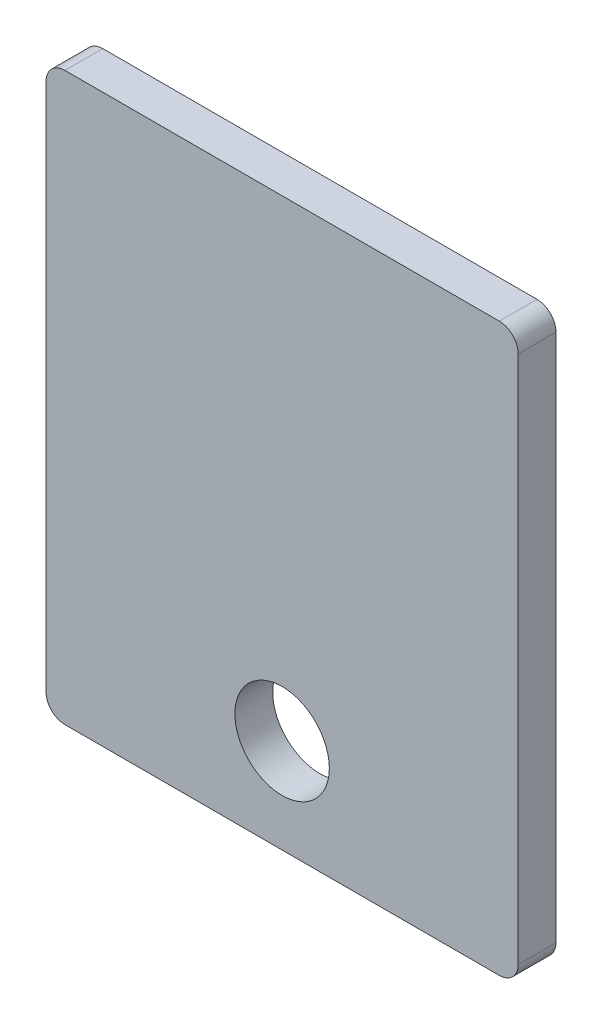
ISO-10303-21;
HEADER;
FILE_DESCRIPTION(('STEP AP214'),'2;1');
FILE_NAME('part.step','',(''),(''),'','','');
FILE_SCHEMA(('AUTOMOTIVE_DESIGN { 1 0 10303 214 1 1 1 1 }'));
ENDSEC;
DATA;
#1=APPLICATION_CONTEXT('core data for automotive mechanical design processes');
#2=APPLICATION_PROTOCOL_DEFINITION('international standard','automotive_design',2000,#1);
#3=PRODUCT_CONTEXT('',#1,'mechanical');
#4=PRODUCT('Part','Part','',(#3));
#5=PRODUCT_RELATED_PRODUCT_CATEGORY('part','',(#4));
#6=PRODUCT_DEFINITION_FORMATION('','',#4);
#7=PRODUCT_DEFINITION_CONTEXT('part definition',#1,'design');
#8=PRODUCT_DEFINITION('design','',#6,#7);
#9=PRODUCT_DEFINITION_SHAPE('','',#8);
#10=(LENGTH_UNIT() NAMED_UNIT(*) SI_UNIT(.MILLI.,.METRE.));
#11=(NAMED_UNIT(*) PLANE_ANGLE_UNIT() SI_UNIT($,.RADIAN.));
#12=(NAMED_UNIT(*) SI_UNIT($,.STERADIAN.) SOLID_ANGLE_UNIT());
#13=UNCERTAINTY_MEASURE_WITH_UNIT(LENGTH_MEASURE(1.E-05),#10,'distance_accuracy_value','');
#14=(GEOMETRIC_REPRESENTATION_CONTEXT(3) GLOBAL_UNCERTAINTY_ASSIGNED_CONTEXT((#13)) GLOBAL_UNIT_ASSIGNED_CONTEXT((#10,
#11,#12)) REPRESENTATION_CONTEXT('',''));
#15=CARTESIAN_POINT('',(0.,0.,0.));
#16=DIRECTION('',(0.,0.,1.));
#17=DIRECTION('',(1.,0.,0.));
#18=AXIS2_PLACEMENT_3D('',#15,#16,#17);
#19=CARTESIAN_POINT('',(0.,-10.,0.));
#20=DIRECTION('',(0.,0.,-1.));
#21=DIRECTION('',(1.,0.,0.));
#22=AXIS2_PLACEMENT_3D('',#19,#20,#21);
#23=CYLINDRICAL_SURFACE('',#22,2.5);
#24=DIRECTION('',(0.,0.,1.));
#25=VECTOR('',#24,1.);
#26=CARTESIAN_POINT('',(2.5,-10.,0.));
#27=LINE('',#26,#25);
#28=CARTESIAN_POINT('',(2.5,-10.,0.));
#29=VERTEX_POINT('',#28);
#30=CARTESIAN_POINT('',(2.5,-10.,2.));
#31=VERTEX_POINT('',#30);
#32=EDGE_CURVE('E9',#29,#31,#27,.T.);
#33=ORIENTED_EDGE('',*,*,#32,.T.);
#34=CARTESIAN_POINT('',(0.,-10.,2.));
#35=DIRECTION('',(0.,0.,1.));
#36=DIRECTION('',(1.,0.,0.));
#37=AXIS2_PLACEMENT_3D('',#34,#35,#36);
#38=CIRCLE('',#37,2.5);
#39=EDGE_CURVE('E203',#31,#31,#38,.T.);
#40=ORIENTED_EDGE('',*,*,#39,.T.);
#41=ORIENTED_EDGE('',*,*,#32,.F.);
#42=CARTESIAN_POINT('',(0.,-10.,0.));
#43=DIRECTION('',(0.,0.,1.));
#44=DIRECTION('',(1.,0.,0.));
#45=AXIS2_PLACEMENT_3D('',#42,#43,#44);
#46=CIRCLE('',#45,2.5);
#47=EDGE_CURVE('E160',#29,#29,#46,.T.);
#48=ORIENTED_EDGE('',*,*,#47,.F.);
#49=EDGE_LOOP('',(#33,#40,#41,#48));
#50=FACE_BOUND('',#49,.T.);
#51=ADVANCED_FACE('F14',(#50),#23,.F.);
#52=CARTESIAN_POINT('',(12.5,-15.,0.));
#53=DIRECTION('',(-1.,0.,0.));
#54=DIRECTION('',(0.,0.,1.));
#55=AXIS2_PLACEMENT_3D('',#52,#53,#54);
#56=PLANE('',#55);
#57=DIRECTION('',(0.,0.,1.));
#58=VECTOR('',#57,1.);
#59=CARTESIAN_POINT('',(12.5,14.,0.));
#60=LINE('',#59,#58);
#61=CARTESIAN_POINT('',(12.5,14.,0.));
#62=VERTEX_POINT('',#61);
#63=CARTESIAN_POINT('',(12.5,14.,2.));
#64=VERTEX_POINT('',#63);
#65=EDGE_CURVE('E63',#62,#64,#60,.T.);
#66=ORIENTED_EDGE('',*,*,#65,.T.);
#67=DIRECTION('',(0.,1.,0.));
#68=VECTOR('',#67,1.);
#69=CARTESIAN_POINT('',(12.5,-15.,2.));
#70=LINE('',#69,#68);
#71=CARTESIAN_POINT('',(12.5,-14.,2.));
#72=VERTEX_POINT('',#71);
#73=EDGE_CURVE('E171',#72,#64,#70,.T.);
#74=ORIENTED_EDGE('',*,*,#73,.F.);
#75=DIRECTION('',(0.,0.,1.));
#76=VECTOR('',#75,1.);
#77=CARTESIAN_POINT('',(12.5,-14.,0.));
#78=LINE('',#77,#76);
#79=CARTESIAN_POINT('',(12.5,-14.,0.));
#80=VERTEX_POINT('',#79);
#81=EDGE_CURVE('E25',#80,#72,#78,.T.);
#82=ORIENTED_EDGE('',*,*,#81,.F.);
#83=DIRECTION('',(0.,1.,0.));
#84=VECTOR('',#83,1.);
#85=CARTESIAN_POINT('',(12.5,-15.,0.));
#86=LINE('',#85,#84);
#87=EDGE_CURVE('E154',#80,#62,#86,.T.);
#88=ORIENTED_EDGE('',*,*,#87,.T.);
#89=EDGE_LOOP('',(#66,#74,#82,#88));
#90=FACE_BOUND('',#89,.T.);
#91=ADVANCED_FACE('F312',(#90),#56,.F.);
#92=CARTESIAN_POINT('',(11.5,-14.,0.));
#93=DIRECTION('',(0.,0.,1.));
#94=DIRECTION('',(0.,-1.,0.));
#95=AXIS2_PLACEMENT_3D('',#92,#93,#94);
#96=CYLINDRICAL_SURFACE('',#95,1.);
#97=CARTESIAN_POINT('',(11.5,-14.,0.));
#98=DIRECTION('',(0.,0.,1.));
#99=DIRECTION('',(0.,-1.,0.));
#100=AXIS2_PLACEMENT_3D('',#97,#98,#99);
#101=CIRCLE('',#100,1.);
#102=CARTESIAN_POINT('',(11.5,-15.,0.));
#103=VERTEX_POINT('',#102);
#104=EDGE_CURVE('E150',#103,#80,#101,.T.);
#105=ORIENTED_EDGE('',*,*,#104,.T.);
#106=ORIENTED_EDGE('',*,*,#81,.T.);
#107=CARTESIAN_POINT('',(11.5,-14.,2.));
#108=DIRECTION('',(0.,0.,1.));
#109=DIRECTION('',(0.,-1.,0.));
#110=AXIS2_PLACEMENT_3D('',#107,#108,#109);
#111=CIRCLE('',#110,1.);
#112=CARTESIAN_POINT('',(11.5,-15.,2.));
#113=VERTEX_POINT('',#112);
#114=EDGE_CURVE('E167',#113,#72,#111,.T.);
#115=ORIENTED_EDGE('',*,*,#114,.F.);
#116=DIRECTION('',(0.,0.,1.));
#117=VECTOR('',#116,1.);
#118=CARTESIAN_POINT('',(11.5,-15.,0.));
#119=LINE('',#118,#117);
#120=EDGE_CURVE('E177',#103,#113,#119,.T.);
#121=ORIENTED_EDGE('',*,*,#120,.F.);
#122=EDGE_LOOP('',(#105,#106,#115,#121));
#123=FACE_BOUND('',#122,.T.);
#124=ADVANCED_FACE('F16',(#123),#96,.T.);
#125=CARTESIAN_POINT('',(11.5,14.,0.));
#126=DIRECTION('',(0.,0.,1.));
#127=DIRECTION('',(1.,0.,0.));
#128=AXIS2_PLACEMENT_3D('',#125,#126,#127);
#129=CYLINDRICAL_SURFACE('',#128,1.);
#130=CARTESIAN_POINT('',(11.5,14.,0.));
#131=DIRECTION('',(0.,0.,1.));
#132=DIRECTION('',(0.,-1.,0.));
#133=AXIS2_PLACEMENT_3D('',#130,#131,#132);
#134=CIRCLE('',#133,1.);
#135=CARTESIAN_POINT('',(11.5,15.,0.));
#136=VERTEX_POINT('',#135);
#137=EDGE_CURVE('E151',#62,#136,#134,.T.);
#138=ORIENTED_EDGE('',*,*,#137,.T.);
#139=DIRECTION('',(0.,0.,1.));
#140=VECTOR('',#139,1.);
#141=CARTESIAN_POINT('',(11.5,15.,0.));
#142=LINE('',#141,#140);
#143=CARTESIAN_POINT('',(11.5,15.,2.));
#144=VERTEX_POINT('',#143);
#145=EDGE_CURVE('E180',#136,#144,#142,.T.);
#146=ORIENTED_EDGE('',*,*,#145,.T.);
#147=CARTESIAN_POINT('',(11.5,14.,2.));
#148=DIRECTION('',(0.,0.,1.));
#149=DIRECTION('',(0.,-1.,0.));
#150=AXIS2_PLACEMENT_3D('',#147,#148,#149);
#151=CIRCLE('',#150,1.);
#152=EDGE_CURVE('E172',#64,#144,#151,.T.);
#153=ORIENTED_EDGE('',*,*,#152,.F.);
#154=ORIENTED_EDGE('',*,*,#65,.F.);
#155=EDGE_LOOP('',(#138,#146,#153,#154));
#156=FACE_BOUND('',#155,.T.);
#157=ADVANCED_FACE('F311',(#156),#129,.T.);
#158=CARTESIAN_POINT('',(-12.5,-15.,0.));
#159=DIRECTION('',(0.,1.,0.));
#160=DIRECTION('',(1.,0.,0.));
#161=AXIS2_PLACEMENT_3D('',#158,#159,#160);
#162=PLANE('',#161);
#163=ORIENTED_EDGE('',*,*,#120,.T.);
#164=DIRECTION('',(1.,0.,0.));
#165=VECTOR('',#164,1.);
#166=CARTESIAN_POINT('',(-12.5,-15.,2.));
#167=LINE('',#166,#165);
#168=CARTESIAN_POINT('',(-11.5,-15.,2.));
#169=VERTEX_POINT('',#168);
#170=EDGE_CURVE('E18',#169,#113,#167,.T.);
#171=ORIENTED_EDGE('',*,*,#170,.F.);
#172=DIRECTION('',(0.,0.,1.));
#173=VECTOR('',#172,1.);
#174=CARTESIAN_POINT('',(-11.5,-15.,0.));
#175=LINE('',#174,#173);
#176=CARTESIAN_POINT('',(-11.5,-15.,0.));
#177=VERTEX_POINT('',#176);
#178=EDGE_CURVE('E121',#177,#169,#175,.T.);
#179=ORIENTED_EDGE('',*,*,#178,.F.);
#180=DIRECTION('',(1.,0.,0.));
#181=VECTOR('',#180,1.);
#182=CARTESIAN_POINT('',(-12.5,-15.,0.));
#183=LINE('',#182,#181);
#184=EDGE_CURVE('E145',#177,#103,#183,.T.);
#185=ORIENTED_EDGE('',*,*,#184,.T.);
#186=EDGE_LOOP('',(#163,#171,#179,#185));
#187=FACE_BOUND('',#186,.T.);
#188=ADVANCED_FACE('F233',(#187),#162,.F.);
#189=CARTESIAN_POINT('',(12.5,15.,0.));
#190=DIRECTION('',(0.,-1.,0.));
#191=DIRECTION('',(0.,0.,-1.));
#192=AXIS2_PLACEMENT_3D('',#189,#190,#191);
#193=PLANE('',#192);
#194=DIRECTION('',(0.,0.,1.));
#195=VECTOR('',#194,1.);
#196=CARTESIAN_POINT('',(-11.5,15.,0.));
#197=LINE('',#196,#195);
#198=CARTESIAN_POINT('',(-11.5,15.,0.));
#199=VERTEX_POINT('',#198);
#200=CARTESIAN_POINT('',(-11.5,15.,2.));
#201=VERTEX_POINT('',#200);
#202=EDGE_CURVE('E163',#199,#201,#197,.T.);
#203=ORIENTED_EDGE('',*,*,#202,.T.);
#204=DIRECTION('',(-1.,0.,0.));
#205=VECTOR('',#204,1.);
#206=CARTESIAN_POINT('',(12.5,15.,2.));
#207=LINE('',#206,#205);
#208=EDGE_CURVE('E176',#144,#201,#207,.T.);
#209=ORIENTED_EDGE('',*,*,#208,.F.);
#210=ORIENTED_EDGE('',*,*,#145,.F.);
#211=DIRECTION('',(-1.,0.,0.));
#212=VECTOR('',#211,1.);
#213=CARTESIAN_POINT('',(12.5,15.,0.));
#214=LINE('',#213,#212);
#215=EDGE_CURVE('E155',#136,#199,#214,.T.);
#216=ORIENTED_EDGE('',*,*,#215,.T.);
#217=EDGE_LOOP('',(#203,#209,#210,#216));
#218=FACE_BOUND('',#217,.T.);
#219=ADVANCED_FACE('F218',(#218),#193,.F.);
#220=CARTESIAN_POINT('',(0.,-1.056211139859,2.));
#221=DIRECTION('',(0.,0.,1.));
#222=DIRECTION('',(1.,0.,0.));
#223=AXIS2_PLACEMENT_3D('',#220,#221,#222);
#224=PLANE('',#223);
#225=ORIENTED_EDGE('',*,*,#39,.F.);
#226=EDGE_LOOP('',(#225));
#227=FACE_BOUND('',#226,.T.);
#228=DIRECTION('',(0.,-1.,0.));
#229=VECTOR('',#228,1.);
#230=CARTESIAN_POINT('',(-12.5,15.,2.));
#231=LINE('',#230,#229);
#232=CARTESIAN_POINT('',(-12.5,14.,2.));
#233=VERTEX_POINT('',#232);
#234=CARTESIAN_POINT('',(-12.5,-14.,2.));
#235=VERTEX_POINT('',#234);
#236=EDGE_CURVE('E126',#233,#235,#231,.T.);
#237=ORIENTED_EDGE('',*,*,#236,.T.);
#238=CARTESIAN_POINT('',(-11.5,-14.,2.));
#239=DIRECTION('',(0.,0.,1.));
#240=DIRECTION('',(0.,-1.,0.));
#241=AXIS2_PLACEMENT_3D('',#238,#239,#240);
#242=CIRCLE('',#241,1.);
#243=EDGE_CURVE('E115',#235,#169,#242,.T.);
#244=ORIENTED_EDGE('',*,*,#243,.T.);
#245=ORIENTED_EDGE('',*,*,#170,.T.);
#246=ORIENTED_EDGE('',*,*,#114,.T.);
#247=ORIENTED_EDGE('',*,*,#73,.T.);
#248=ORIENTED_EDGE('',*,*,#152,.T.);
#249=ORIENTED_EDGE('',*,*,#208,.T.);
#250=CARTESIAN_POINT('',(-11.5,14.,2.));
#251=DIRECTION('',(0.,0.,-1.));
#252=DIRECTION('',(0.,-1.,0.));
#253=AXIS2_PLACEMENT_3D('',#250,#251,#252);
#254=CIRCLE('',#253,1.);
#255=EDGE_CURVE('E104',#233,#201,#254,.T.);
#256=ORIENTED_EDGE('',*,*,#255,.F.);
#257=EDGE_LOOP('',(#237,#244,#245,#246,#247,#248,#249,#256));
#258=FACE_BOUND('',#257,.T.);
#259=ADVANCED_FACE('F127',(#227,#258),#224,.T.);
#260=CARTESIAN_POINT('',(-11.5,-14.,0.));
#261=DIRECTION('',(0.,0.,1.));
#262=DIRECTION('',(-1.,0.,0.));
#263=AXIS2_PLACEMENT_3D('',#260,#261,#262);
#264=CYLINDRICAL_SURFACE('',#263,1.);
#265=CARTESIAN_POINT('',(-11.5,-14.,0.));
#266=DIRECTION('',(0.,0.,1.));
#267=DIRECTION('',(0.,-1.,0.));
#268=AXIS2_PLACEMENT_3D('',#265,#266,#267);
#269=CIRCLE('',#268,1.);
#270=CARTESIAN_POINT('',(-12.5,-14.,0.));
#271=VERTEX_POINT('',#270);
#272=EDGE_CURVE('E149',#271,#177,#269,.T.);
#273=ORIENTED_EDGE('',*,*,#272,.T.);
#274=ORIENTED_EDGE('',*,*,#178,.T.);
#275=ORIENTED_EDGE('',*,*,#243,.F.);
#276=DIRECTION('',(0.,0.,1.));
#277=VECTOR('',#276,1.);
#278=CARTESIAN_POINT('',(-12.5,-14.,0.));
#279=LINE('',#278,#277);
#280=EDGE_CURVE('E119',#271,#235,#279,.T.);
#281=ORIENTED_EDGE('',*,*,#280,.F.);
#282=EDGE_LOOP('',(#273,#274,#275,#281));
#283=FACE_BOUND('',#282,.T.);
#284=ADVANCED_FACE('F117',(#283),#264,.T.);
#285=CARTESIAN_POINT('',(-11.5,14.,0.));
#286=DIRECTION('',(0.,0.,1.));
#287=DIRECTION('',(-1.,0.,0.));
#288=AXIS2_PLACEMENT_3D('',#285,#286,#287);
#289=CYLINDRICAL_SURFACE('',#288,1.);
#290=DIRECTION('',(0.,0.,1.));
#291=VECTOR('',#290,1.);
#292=CARTESIAN_POINT('',(-12.5,14.,0.));
#293=LINE('',#292,#291);
#294=CARTESIAN_POINT('',(-12.5,14.,0.));
#295=VERTEX_POINT('',#294);
#296=EDGE_CURVE('E131',#295,#233,#293,.T.);
#297=ORIENTED_EDGE('',*,*,#296,.T.);
#298=ORIENTED_EDGE('',*,*,#255,.T.);
#299=ORIENTED_EDGE('',*,*,#202,.F.);
#300=CARTESIAN_POINT('',(-11.5,14.,0.));
#301=DIRECTION('',(0.,0.,-1.));
#302=DIRECTION('',(0.,-1.,0.));
#303=AXIS2_PLACEMENT_3D('',#300,#301,#302);
#304=CIRCLE('',#303,1.);
#305=EDGE_CURVE('E186',#295,#199,#304,.T.);
#306=ORIENTED_EDGE('',*,*,#305,.F.);
#307=EDGE_LOOP('',(#297,#298,#299,#306));
#308=FACE_BOUND('',#307,.T.);
#309=ADVANCED_FACE('F224',(#308),#289,.T.);
#310=CARTESIAN_POINT('',(0.,-1.056211139859,0.));
#311=DIRECTION('',(0.,0.,1.));
#312=DIRECTION('',(1.,0.,0.));
#313=AXIS2_PLACEMENT_3D('',#310,#311,#312);
#314=PLANE('',#313);
#315=ORIENTED_EDGE('',*,*,#47,.T.);
#316=EDGE_LOOP('',(#315));
#317=FACE_BOUND('',#316,.T.);
#318=ORIENTED_EDGE('',*,*,#305,.T.);
#319=ORIENTED_EDGE('',*,*,#215,.F.);
#320=ORIENTED_EDGE('',*,*,#137,.F.);
#321=ORIENTED_EDGE('',*,*,#87,.F.);
#322=ORIENTED_EDGE('',*,*,#104,.F.);
#323=ORIENTED_EDGE('',*,*,#184,.F.);
#324=ORIENTED_EDGE('',*,*,#272,.F.);
#325=DIRECTION('',(0.,-1.,0.));
#326=VECTOR('',#325,1.);
#327=CARTESIAN_POINT('',(-12.5,15.,0.));
#328=LINE('',#327,#326);
#329=EDGE_CURVE('E136',#295,#271,#328,.T.);
#330=ORIENTED_EDGE('',*,*,#329,.F.);
#331=EDGE_LOOP('',(#318,#319,#320,#321,#322,#323,#324,#330));
#332=FACE_BOUND('',#331,.T.);
#333=ADVANCED_FACE('F222',(#317,#332),#314,.F.);
#334=CARTESIAN_POINT('',(-12.5,15.,0.));
#335=DIRECTION('',(1.,0.,0.));
#336=DIRECTION('',(0.,1.,0.));
#337=AXIS2_PLACEMENT_3D('',#334,#335,#336);
#338=PLANE('',#337);
#339=ORIENTED_EDGE('',*,*,#280,.T.);
#340=ORIENTED_EDGE('',*,*,#236,.F.);
#341=ORIENTED_EDGE('',*,*,#296,.F.);
#342=ORIENTED_EDGE('',*,*,#329,.T.);
#343=EDGE_LOOP('',(#339,#340,#341,#342));
#344=FACE_BOUND('',#343,.T.);
#345=ADVANCED_FACE('F134',(#344),#338,.F.);
#346=CLOSED_SHELL('',(#51,#91,#124,#157,#188,#219,#259,#284,#309,#333,#345));
#347=MANIFOLD_SOLID_BREP('B1',#346);
#348=ADVANCED_BREP_SHAPE_REPRESENTATION('',(#18,#347),#14);
#349=SHAPE_DEFINITION_REPRESENTATION(#9,#348);
ENDSEC;
END-ISO-10303-21;
